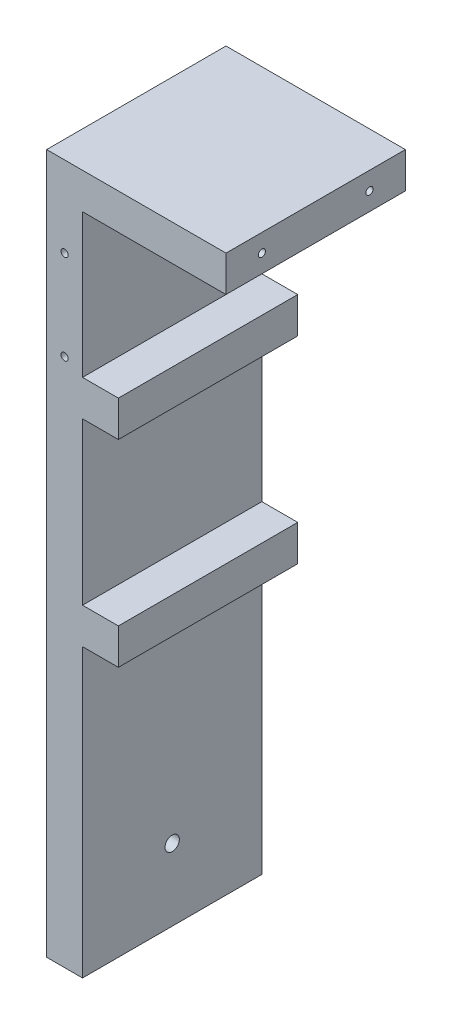
ISO-10303-21;
HEADER;
FILE_DESCRIPTION(('STEP AP214'),'2;1');
FILE_NAME('part.step','',(''),(''),'','','');
FILE_SCHEMA(('AUTOMOTIVE_DESIGN { 1 0 10303 214 1 1 1 1 }'));
ENDSEC;
DATA;
#1=APPLICATION_CONTEXT('core data for automotive mechanical design processes');
#2=APPLICATION_PROTOCOL_DEFINITION('international standard','automotive_design',2000,#1);
#3=PRODUCT_CONTEXT('',#1,'mechanical');
#4=PRODUCT('Part','Part','',(#3));
#5=PRODUCT_RELATED_PRODUCT_CATEGORY('part','',(#4));
#6=PRODUCT_DEFINITION_FORMATION('','',#4);
#7=PRODUCT_DEFINITION_CONTEXT('part definition',#1,'design');
#8=PRODUCT_DEFINITION('design','',#6,#7);
#9=PRODUCT_DEFINITION_SHAPE('','',#8);
#10=(LENGTH_UNIT() NAMED_UNIT(*) SI_UNIT(.MILLI.,.METRE.));
#11=(NAMED_UNIT(*) PLANE_ANGLE_UNIT() SI_UNIT($,.RADIAN.));
#12=(NAMED_UNIT(*) SI_UNIT($,.STERADIAN.) SOLID_ANGLE_UNIT());
#13=UNCERTAINTY_MEASURE_WITH_UNIT(LENGTH_MEASURE(1.E-05),#10,'distance_accuracy_value','');
#14=(GEOMETRIC_REPRESENTATION_CONTEXT(3) GLOBAL_UNCERTAINTY_ASSIGNED_CONTEXT((#13)) GLOBAL_UNIT_ASSIGNED_CONTEXT((#10,
#11,#12)) REPRESENTATION_CONTEXT('',''));
#15=CARTESIAN_POINT('',(0.,0.,0.));
#16=DIRECTION('',(0.,0.,1.));
#17=DIRECTION('',(1.,0.,0.));
#18=AXIS2_PLACEMENT_3D('',#15,#16,#17);
#19=CARTESIAN_POINT('',(10.,0.,0.));
#20=DIRECTION('',(1.,0.,0.));
#21=DIRECTION('',(0.,0.,-1.));
#22=AXIS2_PLACEMENT_3D('',#19,#20,#21);
#23=PLANE('',#22);
#24=DIRECTION('',(0.,0.,1.));
#25=VECTOR('',#24,1.);
#26=CARTESIAN_POINT('',(10.,-2.49999999999999,-39.142135623731));
#27=LINE('',#26,#25);
#28=CARTESIAN_POINT('',(10.,-2.49999999999999,-25.));
#29=VERTEX_POINT('',#28);
#30=CARTESIAN_POINT('',(10.,-2.49999999999999,25.));
#31=VERTEX_POINT('',#30);
#32=EDGE_CURVE('E48',#29,#31,#27,.T.);
#33=ORIENTED_EDGE('',*,*,#32,.F.);
#34=DIRECTION('',(0.,1.,0.));
#35=VECTOR('',#34,1.);
#36=CARTESIAN_POINT('',(10.,92.5,-25.));
#37=LINE('',#36,#35);
#38=CARTESIAN_POINT('',(10.,42.5,-25.));
#39=VERTEX_POINT('',#38);
#40=EDGE_CURVE('E233',#29,#39,#37,.T.);
#41=ORIENTED_EDGE('',*,*,#40,.T.);
#42=DIRECTION('',(0.,0.,1.));
#43=VECTOR('',#42,1.);
#44=CARTESIAN_POINT('',(10.,42.5,-39.142135623731));
#45=LINE('',#44,#43);
#46=CARTESIAN_POINT('',(10.,42.5,25.));
#47=VERTEX_POINT('',#46);
#48=EDGE_CURVE('E221',#39,#47,#45,.T.);
#49=ORIENTED_EDGE('',*,*,#48,.T.);
#50=DIRECTION('',(0.,-1.,0.));
#51=VECTOR('',#50,1.);
#52=CARTESIAN_POINT('',(10.,92.5,25.));
#53=LINE('',#52,#51);
#54=EDGE_CURVE('E241',#47,#31,#53,.T.);
#55=ORIENTED_EDGE('',*,*,#54,.T.);
#56=EDGE_LOOP('',(#33,#41,#49,#55));
#57=FACE_BOUND('',#56,.T.);
#58=ADVANCED_FACE('F33',(#57),#23,.T.);
#59=CARTESIAN_POINT('',(10.,-72.5,0.));
#60=DIRECTION('',(1.,0.,0.));
#61=DIRECTION('',(0.,0.,-1.));
#62=AXIS2_PLACEMENT_3D('',#59,#60,#61);
#63=CIRCLE('',#62,2.);
#64=CARTESIAN_POINT('',(10.,-72.5,-2.00000000000001));
#65=VERTEX_POINT('',#64);
#66=EDGE_CURVE('E178',#65,#65,#63,.T.);
#67=ORIENTED_EDGE('',*,*,#66,.F.);
#68=EDGE_LOOP('',(#67));
#69=FACE_BOUND('',#68,.T.);
#70=DIRECTION('',(0.,0.,1.));
#71=VECTOR('',#70,1.);
#72=CARTESIAN_POINT('',(10.,-12.5,-39.142135623731));
#73=LINE('',#72,#71);
#74=CARTESIAN_POINT('',(10.,-12.5,-25.));
#75=VERTEX_POINT('',#74);
#76=CARTESIAN_POINT('',(10.,-12.5,25.));
#77=VERTEX_POINT('',#76);
#78=EDGE_CURVE('E198',#75,#77,#73,.T.);
#79=ORIENTED_EDGE('',*,*,#78,.T.);
#80=CARTESIAN_POINT('',(10.,-92.5,25.));
#81=VERTEX_POINT('',#80);
#82=EDGE_CURVE('E237',#77,#81,#53,.T.);
#83=ORIENTED_EDGE('',*,*,#82,.T.);
#84=DIRECTION('',(0.,0.,-1.));
#85=VECTOR('',#84,1.);
#86=CARTESIAN_POINT('',(10.,-92.5,25.));
#87=LINE('',#86,#85);
#88=CARTESIAN_POINT('',(10.,-92.5,-25.));
#89=VERTEX_POINT('',#88);
#90=EDGE_CURVE('E240',#81,#89,#87,.T.);
#91=ORIENTED_EDGE('',*,*,#90,.T.);
#92=EDGE_CURVE('E56',#89,#75,#37,.T.);
#93=ORIENTED_EDGE('',*,*,#92,.T.);
#94=EDGE_LOOP('',(#79,#83,#91,#93));
#95=FACE_BOUND('',#94,.T.);
#96=ADVANCED_FACE('F252',(#69,#95),#23,.T.);
#97=CARTESIAN_POINT('',(10.,92.5,-25.));
#98=DIRECTION('',(0.,0.,1.));
#99=DIRECTION('',(0.,-1.,0.));
#100=AXIS2_PLACEMENT_3D('',#97,#98,#99);
#101=PLANE('',#100);
#102=CARTESIAN_POINT('',(5.,55.,-25.));
#103=DIRECTION('',(0.,0.,1.));
#104=DIRECTION('',(1.,0.,0.));
#105=AXIS2_PLACEMENT_3D('',#102,#103,#104);
#106=CIRCLE('',#105,1.);
#107=CARTESIAN_POINT('',(6.,55.,-25.));
#108=VERTEX_POINT('',#107);
#109=EDGE_CURVE('E321',#108,#108,#106,.T.);
#110=ORIENTED_EDGE('',*,*,#109,.T.);
#111=EDGE_LOOP('',(#110));
#112=FACE_BOUND('',#111,.T.);
#113=CARTESIAN_POINT('',(5.,80.,-25.));
#114=DIRECTION('',(0.,0.,1.));
#115=DIRECTION('',(1.,0.,0.));
#116=AXIS2_PLACEMENT_3D('',#113,#114,#115);
#117=CIRCLE('',#116,1.);
#118=CARTESIAN_POINT('',(6.,80.,-25.));
#119=VERTEX_POINT('',#118);
#120=EDGE_CURVE('E173',#119,#119,#117,.T.);
#121=ORIENTED_EDGE('',*,*,#120,.T.);
#122=EDGE_LOOP('',(#121));
#123=FACE_BOUND('',#122,.T.);
#124=DIRECTION('',(0.,1.,0.));
#125=VECTOR('',#124,1.);
#126=CARTESIAN_POINT('',(0.,92.5,-25.));
#127=LINE('',#126,#125);
#128=CARTESIAN_POINT('',(0.,-92.5,-25.));
#129=VERTEX_POINT('',#128);
#130=CARTESIAN_POINT('',(0.,102.5,-25.));
#131=VERTEX_POINT('',#130);
#132=EDGE_CURVE('E144',#129,#131,#127,.T.);
#133=ORIENTED_EDGE('',*,*,#132,.T.);
#134=DIRECTION('',(-1.,0.,0.));
#135=VECTOR('',#134,1.);
#136=CARTESIAN_POINT('',(0.,102.5,-25.));
#137=LINE('',#136,#135);
#138=CARTESIAN_POINT('',(50.,102.5,-25.));
#139=VERTEX_POINT('',#138);
#140=EDGE_CURVE('E158',#139,#131,#137,.T.);
#141=ORIENTED_EDGE('',*,*,#140,.F.);
#142=DIRECTION('',(0.,-1.,0.));
#143=VECTOR('',#142,1.);
#144=CARTESIAN_POINT('',(50.,102.5,-25.));
#145=LINE('',#144,#143);
#146=CARTESIAN_POINT('',(50.,92.5,-25.));
#147=VERTEX_POINT('',#146);
#148=EDGE_CURVE('E170',#139,#147,#145,.T.);
#149=ORIENTED_EDGE('',*,*,#148,.T.);
#150=DIRECTION('',(-1.,0.,0.));
#151=VECTOR('',#150,1.);
#152=CARTESIAN_POINT('',(0.,92.5,-25.));
#153=LINE('',#152,#151);
#154=CARTESIAN_POINT('',(10.,92.5,-25.));
#155=VERTEX_POINT('',#154);
#156=EDGE_CURVE('E159',#147,#155,#153,.T.);
#157=ORIENTED_EDGE('',*,*,#156,.T.);
#158=CARTESIAN_POINT('',(10.,52.5,-25.));
#159=VERTEX_POINT('',#158);
#160=EDGE_CURVE('E234',#159,#155,#37,.T.);
#161=ORIENTED_EDGE('',*,*,#160,.F.);
#162=DIRECTION('',(1.,0.,0.));
#163=VECTOR('',#162,1.);
#164=CARTESIAN_POINT('',(10.,52.5,-25.));
#165=LINE('',#164,#163);
#166=CARTESIAN_POINT('',(20.,52.5,-25.));
#167=VERTEX_POINT('',#166);
#168=EDGE_CURVE('E209',#159,#167,#165,.T.);
#169=ORIENTED_EDGE('',*,*,#168,.T.);
#170=DIRECTION('',(0.,-1.,0.));
#171=VECTOR('',#170,1.);
#172=CARTESIAN_POINT('',(20.,52.5,-25.));
#173=LINE('',#172,#171);
#174=CARTESIAN_POINT('',(20.,42.5,-25.));
#175=VERTEX_POINT('',#174);
#176=EDGE_CURVE('E207',#167,#175,#173,.T.);
#177=ORIENTED_EDGE('',*,*,#176,.T.);
#178=DIRECTION('',(-1.,0.,0.));
#179=VECTOR('',#178,1.);
#180=CARTESIAN_POINT('',(10.,42.5,-25.));
#181=LINE('',#180,#179);
#182=EDGE_CURVE('E212',#175,#39,#181,.T.);
#183=ORIENTED_EDGE('',*,*,#182,.T.);
#184=ORIENTED_EDGE('',*,*,#40,.F.);
#185=DIRECTION('',(1.,0.,0.));
#186=VECTOR('',#185,1.);
#187=CARTESIAN_POINT('',(10.,-2.49999999999999,-25.));
#188=LINE('',#187,#186);
#189=CARTESIAN_POINT('',(20.,-2.49999999999999,-25.));
#190=VERTEX_POINT('',#189);
#191=EDGE_CURVE('E187',#29,#190,#188,.T.);
#192=ORIENTED_EDGE('',*,*,#191,.T.);
#193=DIRECTION('',(0.,-1.,0.));
#194=VECTOR('',#193,1.);
#195=CARTESIAN_POINT('',(20.,-2.49999999999999,-25.));
#196=LINE('',#195,#194);
#197=CARTESIAN_POINT('',(20.,-12.5,-25.));
#198=VERTEX_POINT('',#197);
#199=EDGE_CURVE('E185',#190,#198,#196,.T.);
#200=ORIENTED_EDGE('',*,*,#199,.T.);
#201=DIRECTION('',(-1.,0.,0.));
#202=VECTOR('',#201,1.);
#203=CARTESIAN_POINT('',(10.,-12.5,-25.));
#204=LINE('',#203,#202);
#205=EDGE_CURVE('E189',#198,#75,#204,.T.);
#206=ORIENTED_EDGE('',*,*,#205,.T.);
#207=ORIENTED_EDGE('',*,*,#92,.F.);
#208=DIRECTION('',(-1.,0.,0.));
#209=VECTOR('',#208,1.);
#210=CARTESIAN_POINT('',(10.,-92.5,-25.));
#211=LINE('',#210,#209);
#212=EDGE_CURVE('E41',#89,#129,#211,.T.);
#213=ORIENTED_EDGE('',*,*,#212,.T.);
#214=EDGE_LOOP('',(#133,#141,#149,#157,#161,#169,#177,#183,#184,#192,#200,#206,#207,#213));
#215=FACE_BOUND('',#214,.T.);
#216=ADVANCED_FACE('F35',(#112,#123,#215),#101,.F.);
#217=CARTESIAN_POINT('',(10.,92.5,25.));
#218=DIRECTION('',(0.,0.,-1.));
#219=DIRECTION('',(0.,1.,0.));
#220=AXIS2_PLACEMENT_3D('',#217,#218,#219);
#221=PLANE('',#220);
#222=CARTESIAN_POINT('',(5.,55.,25.));
#223=DIRECTION('',(0.,0.,1.));
#224=DIRECTION('',(1.,0.,0.));
#225=AXIS2_PLACEMENT_3D('',#222,#223,#224);
#226=CIRCLE('',#225,1.);
#227=CARTESIAN_POINT('',(6.,55.,25.));
#228=VERTEX_POINT('',#227);
#229=EDGE_CURVE('E317',#228,#228,#226,.T.);
#230=ORIENTED_EDGE('',*,*,#229,.F.);
#231=EDGE_LOOP('',(#230));
#232=FACE_BOUND('',#231,.T.);
#233=CARTESIAN_POINT('',(5.,80.,25.));
#234=DIRECTION('',(0.,0.,1.));
#235=DIRECTION('',(1.,0.,0.));
#236=AXIS2_PLACEMENT_3D('',#233,#234,#235);
#237=CIRCLE('',#236,1.);
#238=CARTESIAN_POINT('',(6.,80.,25.));
#239=VERTEX_POINT('',#238);
#240=EDGE_CURVE('E165',#239,#239,#237,.T.);
#241=ORIENTED_EDGE('',*,*,#240,.F.);
#242=EDGE_LOOP('',(#241));
#243=FACE_BOUND('',#242,.T.);
#244=DIRECTION('',(0.,-1.,0.));
#245=VECTOR('',#244,1.);
#246=CARTESIAN_POINT('',(0.,92.5,25.));
#247=LINE('',#246,#245);
#248=CARTESIAN_POINT('',(0.,102.5,25.));
#249=VERTEX_POINT('',#248);
#250=CARTESIAN_POINT('',(0.,-92.5,25.));
#251=VERTEX_POINT('',#250);
#252=EDGE_CURVE('E135',#249,#251,#247,.T.);
#253=ORIENTED_EDGE('',*,*,#252,.T.);
#254=DIRECTION('',(-1.,0.,0.));
#255=VECTOR('',#254,1.);
#256=CARTESIAN_POINT('',(10.,-92.5,25.));
#257=LINE('',#256,#255);
#258=EDGE_CURVE('E11',#81,#251,#257,.T.);
#259=ORIENTED_EDGE('',*,*,#258,.F.);
#260=ORIENTED_EDGE('',*,*,#82,.F.);
#261=DIRECTION('',(1.,0.,0.));
#262=VECTOR('',#261,1.);
#263=CARTESIAN_POINT('',(10.,-12.5,25.));
#264=LINE('',#263,#262);
#265=CARTESIAN_POINT('',(20.,-12.5,25.));
#266=VERTEX_POINT('',#265);
#267=EDGE_CURVE('E182',#77,#266,#264,.T.);
#268=ORIENTED_EDGE('',*,*,#267,.T.);
#269=DIRECTION('',(0.,1.,0.));
#270=VECTOR('',#269,1.);
#271=CARTESIAN_POINT('',(20.,-2.49999999999999,25.));
#272=LINE('',#271,#270);
#273=CARTESIAN_POINT('',(20.,-2.49999999999999,25.));
#274=VERTEX_POINT('',#273);
#275=EDGE_CURVE('E192',#266,#274,#272,.T.);
#276=ORIENTED_EDGE('',*,*,#275,.T.);
#277=DIRECTION('',(-1.,0.,0.));
#278=VECTOR('',#277,1.);
#279=CARTESIAN_POINT('',(10.,-2.49999999999999,25.));
#280=LINE('',#279,#278);
#281=EDGE_CURVE('E195',#274,#31,#280,.T.);
#282=ORIENTED_EDGE('',*,*,#281,.T.);
#283=ORIENTED_EDGE('',*,*,#54,.F.);
#284=DIRECTION('',(1.,0.,0.));
#285=VECTOR('',#284,1.);
#286=CARTESIAN_POINT('',(10.,42.5,25.));
#287=LINE('',#286,#285);
#288=CARTESIAN_POINT('',(20.,42.5,25.));
#289=VERTEX_POINT('',#288);
#290=EDGE_CURVE('E206',#47,#289,#287,.T.);
#291=ORIENTED_EDGE('',*,*,#290,.T.);
#292=DIRECTION('',(0.,1.,0.));
#293=VECTOR('',#292,1.);
#294=CARTESIAN_POINT('',(20.,52.5,25.));
#295=LINE('',#294,#293);
#296=CARTESIAN_POINT('',(20.,52.5,25.));
#297=VERTEX_POINT('',#296);
#298=EDGE_CURVE('E215',#289,#297,#295,.T.);
#299=ORIENTED_EDGE('',*,*,#298,.T.);
#300=DIRECTION('',(-1.,0.,0.));
#301=VECTOR('',#300,1.);
#302=CARTESIAN_POINT('',(10.,52.5,25.));
#303=LINE('',#302,#301);
#304=CARTESIAN_POINT('',(10.,52.5,25.));
#305=VERTEX_POINT('',#304);
#306=EDGE_CURVE('E218',#297,#305,#303,.T.);
#307=ORIENTED_EDGE('',*,*,#306,.T.);
#308=CARTESIAN_POINT('',(10.,92.5,25.));
#309=VERTEX_POINT('',#308);
#310=EDGE_CURVE('E238',#309,#305,#53,.T.);
#311=ORIENTED_EDGE('',*,*,#310,.F.);
#312=DIRECTION('',(1.,0.,0.));
#313=VECTOR('',#312,1.);
#314=CARTESIAN_POINT('',(0.,92.5,25.));
#315=LINE('',#314,#313);
#316=CARTESIAN_POINT('',(50.,92.5,25.));
#317=VERTEX_POINT('',#316);
#318=EDGE_CURVE('E171',#309,#317,#315,.T.);
#319=ORIENTED_EDGE('',*,*,#318,.T.);
#320=DIRECTION('',(0.,-1.,0.));
#321=VECTOR('',#320,1.);
#322=CARTESIAN_POINT('',(50.,102.5,25.));
#323=LINE('',#322,#321);
#324=CARTESIAN_POINT('',(50.,102.5,25.));
#325=VERTEX_POINT('',#324);
#326=EDGE_CURVE('E150',#325,#317,#323,.T.);
#327=ORIENTED_EDGE('',*,*,#326,.F.);
#328=DIRECTION('',(1.,0.,0.));
#329=VECTOR('',#328,1.);
#330=CARTESIAN_POINT('',(0.,102.5,25.));
#331=LINE('',#330,#329);
#332=EDGE_CURVE('E147',#249,#325,#331,.T.);
#333=ORIENTED_EDGE('',*,*,#332,.F.);
#334=EDGE_LOOP('',(#253,#259,#260,#268,#276,#282,#283,#291,#299,#307,#311,#319,#327,#333));
#335=FACE_BOUND('',#334,.T.);
#336=ADVANCED_FACE('F148',(#232,#243,#335),#221,.F.);
#337=CARTESIAN_POINT('',(10.,-92.5,25.));
#338=DIRECTION('',(0.,1.,0.));
#339=DIRECTION('',(0.,0.,1.));
#340=AXIS2_PLACEMENT_3D('',#337,#338,#339);
#341=PLANE('',#340);
#342=DIRECTION('',(0.,0.,-1.));
#343=VECTOR('',#342,1.);
#344=CARTESIAN_POINT('',(0.,-92.5,25.));
#345=LINE('',#344,#343);
#346=EDGE_CURVE('E141',#251,#129,#345,.T.);
#347=ORIENTED_EDGE('',*,*,#346,.T.);
#348=ORIENTED_EDGE('',*,*,#212,.F.);
#349=ORIENTED_EDGE('',*,*,#90,.F.);
#350=ORIENTED_EDGE('',*,*,#258,.T.);
#351=EDGE_LOOP('',(#347,#348,#349,#350));
#352=FACE_BOUND('',#351,.T.);
#353=ADVANCED_FACE('F249',(#352),#341,.F.);
#354=DIRECTION('',(0.,0.,1.));
#355=VECTOR('',#354,1.);
#356=CARTESIAN_POINT('',(10.,52.5,-39.142135623731));
#357=LINE('',#356,#355);
#358=EDGE_CURVE('E210',#159,#305,#357,.T.);
#359=ORIENTED_EDGE('',*,*,#358,.F.);
#360=ORIENTED_EDGE('',*,*,#160,.T.);
#361=DIRECTION('',(0.,0.,1.));
#362=VECTOR('',#361,1.);
#363=CARTESIAN_POINT('',(10.,92.5,25.));
#364=LINE('',#363,#362);
#365=EDGE_CURVE('E232',#155,#309,#364,.T.);
#366=ORIENTED_EDGE('',*,*,#365,.T.);
#367=ORIENTED_EDGE('',*,*,#310,.T.);
#368=EDGE_LOOP('',(#359,#360,#366,#367));
#369=FACE_BOUND('',#368,.T.);
#370=ADVANCED_FACE('F272',(#369),#23,.T.);
#371=CARTESIAN_POINT('',(0.,0.,0.));
#372=DIRECTION('',(1.,0.,0.));
#373=DIRECTION('',(0.,0.,-1.));
#374=AXIS2_PLACEMENT_3D('',#371,#372,#373);
#375=PLANE('',#374);
#376=CARTESIAN_POINT('',(0.,-72.5,0.));
#377=DIRECTION('',(1.,0.,0.));
#378=DIRECTION('',(0.,0.,-1.));
#379=AXIS2_PLACEMENT_3D('',#376,#377,#378);
#380=CIRCLE('',#379,2.);
#381=CARTESIAN_POINT('',(0.,-72.5,-2.00000000000001));
#382=VERTEX_POINT('',#381);
#383=EDGE_CURVE('E179',#382,#382,#380,.T.);
#384=ORIENTED_EDGE('',*,*,#383,.T.);
#385=EDGE_LOOP('',(#384));
#386=FACE_BOUND('',#385,.T.);
#387=ORIENTED_EDGE('',*,*,#132,.F.);
#388=ORIENTED_EDGE('',*,*,#346,.F.);
#389=ORIENTED_EDGE('',*,*,#252,.F.);
#390=DIRECTION('',(0.,0.,1.));
#391=VECTOR('',#390,1.);
#392=CARTESIAN_POINT('',(0.,102.5,25.));
#393=LINE('',#392,#391);
#394=EDGE_CURVE('E140',#131,#249,#393,.T.);
#395=ORIENTED_EDGE('',*,*,#394,.F.);
#396=EDGE_LOOP('',(#387,#388,#389,#395));
#397=FACE_BOUND('',#396,.T.);
#398=ADVANCED_FACE('F138',(#386,#397),#375,.F.);
#399=CARTESIAN_POINT('',(10.,52.5,-39.142135623731));
#400=DIRECTION('',(0.,1.,0.));
#401=DIRECTION('',(0.,0.,1.));
#402=AXIS2_PLACEMENT_3D('',#399,#400,#401);
#403=PLANE('',#402);
#404=ORIENTED_EDGE('',*,*,#168,.F.);
#405=ORIENTED_EDGE('',*,*,#358,.T.);
#406=ORIENTED_EDGE('',*,*,#306,.F.);
#407=DIRECTION('',(0.,0.,1.));
#408=VECTOR('',#407,1.);
#409=CARTESIAN_POINT('',(20.,52.5,-39.142135623731));
#410=LINE('',#409,#408);
#411=EDGE_CURVE('E224',#167,#297,#410,.T.);
#412=ORIENTED_EDGE('',*,*,#411,.F.);
#413=EDGE_LOOP('',(#404,#405,#406,#412));
#414=FACE_BOUND('',#413,.T.);
#415=ADVANCED_FACE('F279',(#414),#403,.T.);
#416=CARTESIAN_POINT('',(20.,52.5,-39.142135623731));
#417=DIRECTION('',(1.,0.,0.));
#418=DIRECTION('',(0.,0.,-1.));
#419=AXIS2_PLACEMENT_3D('',#416,#417,#418);
#420=PLANE('',#419);
#421=ORIENTED_EDGE('',*,*,#176,.F.);
#422=ORIENTED_EDGE('',*,*,#411,.T.);
#423=ORIENTED_EDGE('',*,*,#298,.F.);
#424=DIRECTION('',(0.,0.,1.));
#425=VECTOR('',#424,1.);
#426=CARTESIAN_POINT('',(20.,42.5,-39.142135623731));
#427=LINE('',#426,#425);
#428=EDGE_CURVE('E226',#175,#289,#427,.T.);
#429=ORIENTED_EDGE('',*,*,#428,.F.);
#430=EDGE_LOOP('',(#421,#422,#423,#429));
#431=FACE_BOUND('',#430,.T.);
#432=ADVANCED_FACE('F283',(#431),#420,.T.);
#433=CARTESIAN_POINT('',(10.,42.5,-39.142135623731));
#434=DIRECTION('',(0.,-1.,0.));
#435=DIRECTION('',(0.,0.,-1.));
#436=AXIS2_PLACEMENT_3D('',#433,#434,#435);
#437=PLANE('',#436);
#438=ORIENTED_EDGE('',*,*,#182,.F.);
#439=ORIENTED_EDGE('',*,*,#428,.T.);
#440=ORIENTED_EDGE('',*,*,#290,.F.);
#441=ORIENTED_EDGE('',*,*,#48,.F.);
#442=EDGE_LOOP('',(#438,#439,#440,#441));
#443=FACE_BOUND('',#442,.T.);
#444=ADVANCED_FACE('F287',(#443),#437,.T.);
#445=CARTESIAN_POINT('',(10.,-2.49999999999999,-39.142135623731));
#446=DIRECTION('',(0.,1.,0.));
#447=DIRECTION('',(0.,0.,1.));
#448=AXIS2_PLACEMENT_3D('',#445,#446,#447);
#449=PLANE('',#448);
#450=ORIENTED_EDGE('',*,*,#191,.F.);
#451=ORIENTED_EDGE('',*,*,#32,.T.);
#452=ORIENTED_EDGE('',*,*,#281,.F.);
#453=DIRECTION('',(0.,0.,1.));
#454=VECTOR('',#453,1.);
#455=CARTESIAN_POINT('',(20.,-2.49999999999999,-39.142135623731));
#456=LINE('',#455,#454);
#457=EDGE_CURVE('E200',#190,#274,#456,.T.);
#458=ORIENTED_EDGE('',*,*,#457,.F.);
#459=EDGE_LOOP('',(#450,#451,#452,#458));
#460=FACE_BOUND('',#459,.T.);
#461=ADVANCED_FACE('F266',(#460),#449,.T.);
#462=CARTESIAN_POINT('',(20.,-2.49999999999999,-39.142135623731));
#463=DIRECTION('',(1.,0.,0.));
#464=DIRECTION('',(0.,1.,0.));
#465=AXIS2_PLACEMENT_3D('',#462,#463,#464);
#466=PLANE('',#465);
#467=ORIENTED_EDGE('',*,*,#199,.F.);
#468=ORIENTED_EDGE('',*,*,#457,.T.);
#469=ORIENTED_EDGE('',*,*,#275,.F.);
#470=DIRECTION('',(0.,0.,1.));
#471=VECTOR('',#470,1.);
#472=CARTESIAN_POINT('',(20.,-12.5,-39.142135623731));
#473=LINE('',#472,#471);
#474=EDGE_CURVE('E202',#198,#266,#473,.T.);
#475=ORIENTED_EDGE('',*,*,#474,.F.);
#476=EDGE_LOOP('',(#467,#468,#469,#475));
#477=FACE_BOUND('',#476,.T.);
#478=ADVANCED_FACE('F260',(#477),#466,.T.);
#479=CARTESIAN_POINT('',(10.,-12.5,-39.142135623731));
#480=DIRECTION('',(0.,-1.,0.));
#481=DIRECTION('',(1.,0.,0.));
#482=AXIS2_PLACEMENT_3D('',#479,#480,#481);
#483=PLANE('',#482);
#484=ORIENTED_EDGE('',*,*,#205,.F.);
#485=ORIENTED_EDGE('',*,*,#474,.T.);
#486=ORIENTED_EDGE('',*,*,#267,.F.);
#487=ORIENTED_EDGE('',*,*,#78,.F.);
#488=EDGE_LOOP('',(#484,#485,#486,#487));
#489=FACE_BOUND('',#488,.T.);
#490=ADVANCED_FACE('F255',(#489),#483,.T.);
#491=CARTESIAN_POINT('',(0.,-72.5,0.));
#492=DIRECTION('',(1.,0.,0.));
#493=DIRECTION('',(0.,0.,-1.));
#494=AXIS2_PLACEMENT_3D('',#491,#492,#493);
#495=CYLINDRICAL_SURFACE('',#494,2.);
#496=ORIENTED_EDGE('',*,*,#383,.F.);
#497=EDGE_LOOP('',(#496));
#498=FACE_BOUND('',#497,.T.);
#499=ORIENTED_EDGE('',*,*,#66,.T.);
#500=EDGE_LOOP('',(#499));
#501=FACE_BOUND('',#500,.T.);
#502=ADVANCED_FACE('F361',(#498,#501),#495,.F.);
#503=CARTESIAN_POINT('',(0.,92.5,0.));
#504=DIRECTION('',(0.,-1.,0.));
#505=DIRECTION('',(0.,0.,-1.));
#506=AXIS2_PLACEMENT_3D('',#503,#504,#505);
#507=PLANE('',#506);
#508=ORIENTED_EDGE('',*,*,#365,.F.);
#509=ORIENTED_EDGE('',*,*,#156,.F.);
#510=DIRECTION('',(0.,0.,-1.));
#511=VECTOR('',#510,1.);
#512=CARTESIAN_POINT('',(50.,92.5,25.));
#513=LINE('',#512,#511);
#514=EDGE_CURVE('E162',#317,#147,#513,.T.);
#515=ORIENTED_EDGE('',*,*,#514,.F.);
#516=ORIENTED_EDGE('',*,*,#318,.F.);
#517=EDGE_LOOP('',(#508,#509,#515,#516));
#518=FACE_BOUND('',#517,.T.);
#519=ADVANCED_FACE('F353',(#518),#507,.T.);
#520=CARTESIAN_POINT('',(50.,102.5,25.));
#521=DIRECTION('',(-1.,0.,0.));
#522=DIRECTION('',(0.,0.,1.));
#523=AXIS2_PLACEMENT_3D('',#520,#521,#522);
#524=PLANE('',#523);
#525=CARTESIAN_POINT('',(50.,97.5,-15.));
#526=DIRECTION('',(1.,0.,0.));
#527=DIRECTION('',(0.,0.,-1.));
#528=AXIS2_PLACEMENT_3D('',#525,#526,#527);
#529=CIRCLE('',#528,1.);
#530=CARTESIAN_POINT('',(50.,97.5,-16.));
#531=VERTEX_POINT('',#530);
#532=EDGE_CURVE('E335',#531,#531,#529,.T.);
#533=ORIENTED_EDGE('',*,*,#532,.F.);
#534=EDGE_LOOP('',(#533));
#535=FACE_BOUND('',#534,.T.);
#536=CARTESIAN_POINT('',(50.,97.5,15.));
#537=DIRECTION('',(1.,0.,0.));
#538=DIRECTION('',(0.,0.,-1.));
#539=AXIS2_PLACEMENT_3D('',#536,#537,#538);
#540=CIRCLE('',#539,1.);
#541=CARTESIAN_POINT('',(50.,97.5,14.));
#542=VERTEX_POINT('',#541);
#543=EDGE_CURVE('E329',#542,#542,#540,.T.);
#544=ORIENTED_EDGE('',*,*,#543,.F.);
#545=EDGE_LOOP('',(#544));
#546=FACE_BOUND('',#545,.T.);
#547=ORIENTED_EDGE('',*,*,#514,.T.);
#548=ORIENTED_EDGE('',*,*,#148,.F.);
#549=DIRECTION('',(0.,0.,-1.));
#550=VECTOR('',#549,1.);
#551=CARTESIAN_POINT('',(50.,102.5,25.));
#552=LINE('',#551,#550);
#553=EDGE_CURVE('E153',#325,#139,#552,.T.);
#554=ORIENTED_EDGE('',*,*,#553,.F.);
#555=ORIENTED_EDGE('',*,*,#326,.T.);
#556=EDGE_LOOP('',(#547,#548,#554,#555));
#557=FACE_BOUND('',#556,.T.);
#558=ADVANCED_FACE('F350',(#535,#546,#557),#524,.F.);
#559=CARTESIAN_POINT('',(0.,102.5,0.));
#560=DIRECTION('',(0.,-1.,0.));
#561=DIRECTION('',(0.,0.,-1.));
#562=AXIS2_PLACEMENT_3D('',#559,#560,#561);
#563=PLANE('',#562);
#564=ORIENTED_EDGE('',*,*,#394,.T.);
#565=ORIENTED_EDGE('',*,*,#332,.T.);
#566=ORIENTED_EDGE('',*,*,#553,.T.);
#567=ORIENTED_EDGE('',*,*,#140,.T.);
#568=EDGE_LOOP('',(#564,#565,#566,#567));
#569=FACE_BOUND('',#568,.T.);
#570=ADVANCED_FACE('F156',(#569),#563,.F.);
#571=CARTESIAN_POINT('',(5.,80.,-25.));
#572=DIRECTION('',(0.,0.,1.));
#573=DIRECTION('',(1.,0.,0.));
#574=AXIS2_PLACEMENT_3D('',#571,#572,#573);
#575=CYLINDRICAL_SURFACE('',#574,1.);
#576=ORIENTED_EDGE('',*,*,#120,.F.);
#577=EDGE_LOOP('',(#576));
#578=FACE_BOUND('',#577,.T.);
#579=ORIENTED_EDGE('',*,*,#240,.T.);
#580=EDGE_LOOP('',(#579));
#581=FACE_BOUND('',#580,.T.);
#582=ADVANCED_FACE('F431',(#578,#581),#575,.F.);
#583=CARTESIAN_POINT('',(5.,55.,-25.));
#584=DIRECTION('',(0.,0.,1.));
#585=DIRECTION('',(1.,0.,0.));
#586=AXIS2_PLACEMENT_3D('',#583,#584,#585);
#587=CYLINDRICAL_SURFACE('',#586,1.);
#588=ORIENTED_EDGE('',*,*,#109,.F.);
#589=EDGE_LOOP('',(#588));
#590=FACE_BOUND('',#589,.T.);
#591=ORIENTED_EDGE('',*,*,#229,.T.);
#592=EDGE_LOOP('',(#591));
#593=FACE_BOUND('',#592,.T.);
#594=ADVANCED_FACE('F440',(#590,#593),#587,.F.);
#595=CARTESIAN_POINT('',(40.,97.5,15.));
#596=DIRECTION('',(1.,0.,0.));
#597=DIRECTION('',(0.,0.,-1.));
#598=AXIS2_PLACEMENT_3D('',#595,#596,#597);
#599=CYLINDRICAL_SURFACE('',#598,1.);
#600=CARTESIAN_POINT('',(40.,97.5,15.));
#601=DIRECTION('',(1.,0.,0.));
#602=DIRECTION('',(0.,0.,-1.));
#603=AXIS2_PLACEMENT_3D('',#600,#601,#602);
#604=CIRCLE('',#603,1.);
#605=CARTESIAN_POINT('',(40.,97.5,14.));
#606=VERTEX_POINT('',#605);
#607=EDGE_CURVE('E326',#606,#606,#604,.T.);
#608=ORIENTED_EDGE('',*,*,#607,.F.);
#609=EDGE_LOOP('',(#608));
#610=FACE_BOUND('',#609,.T.);
#611=ORIENTED_EDGE('',*,*,#543,.T.);
#612=EDGE_LOOP('',(#611));
#613=FACE_BOUND('',#612,.T.);
#614=ADVANCED_FACE('F446',(#610,#613),#599,.F.);
#615=CARTESIAN_POINT('',(40.,97.5,15.));
#616=DIRECTION('',(1.,0.,0.));
#617=DIRECTION('',(0.,0.,-1.));
#618=AXIS2_PLACEMENT_3D('',#615,#616,#617);
#619=PLANE('',#618);
#620=ORIENTED_EDGE('',*,*,#607,.T.);
#621=EDGE_LOOP('',(#620));
#622=FACE_BOUND('',#621,.T.);
#623=ADVANCED_FACE('F346',(#622),#619,.T.);
#624=CARTESIAN_POINT('',(40.,97.5,-15.));
#625=DIRECTION('',(1.,0.,0.));
#626=DIRECTION('',(0.,0.,-1.));
#627=AXIS2_PLACEMENT_3D('',#624,#625,#626);
#628=CYLINDRICAL_SURFACE('',#627,1.);
#629=CARTESIAN_POINT('',(40.,97.5,-15.));
#630=DIRECTION('',(1.,0.,0.));
#631=DIRECTION('',(0.,0.,-1.));
#632=AXIS2_PLACEMENT_3D('',#629,#630,#631);
#633=CIRCLE('',#632,1.);
#634=CARTESIAN_POINT('',(40.,97.5,-16.));
#635=VERTEX_POINT('',#634);
#636=EDGE_CURVE('E332',#635,#635,#633,.T.);
#637=ORIENTED_EDGE('',*,*,#636,.F.);
#638=EDGE_LOOP('',(#637));
#639=FACE_BOUND('',#638,.T.);
#640=ORIENTED_EDGE('',*,*,#532,.T.);
#641=EDGE_LOOP('',(#640));
#642=FACE_BOUND('',#641,.T.);
#643=ADVANCED_FACE('F343',(#639,#642),#628,.F.);
#644=CARTESIAN_POINT('',(40.,97.5,-15.));
#645=DIRECTION('',(1.,0.,0.));
#646=DIRECTION('',(0.,0.,-1.));
#647=AXIS2_PLACEMENT_3D('',#644,#645,#646);
#648=PLANE('',#647);
#649=ORIENTED_EDGE('',*,*,#636,.T.);
#650=EDGE_LOOP('',(#649));
#651=FACE_BOUND('',#650,.T.);
#652=ADVANCED_FACE('F341',(#651),#648,.T.);
#653=CLOSED_SHELL('',(#58,#96,#216,#336,#353,#370,#398,#415,#432,#444,#461,#478,#490,#502,#519,
#558,#570,#582,#594,#614,#623,#643,#652));
#654=MANIFOLD_SOLID_BREP('B2',#653);
#655=ADVANCED_BREP_SHAPE_REPRESENTATION('',(#18,#654),#14);
#656=SHAPE_DEFINITION_REPRESENTATION(#9,#655);
ENDSEC;
END-ISO-10303-21;
